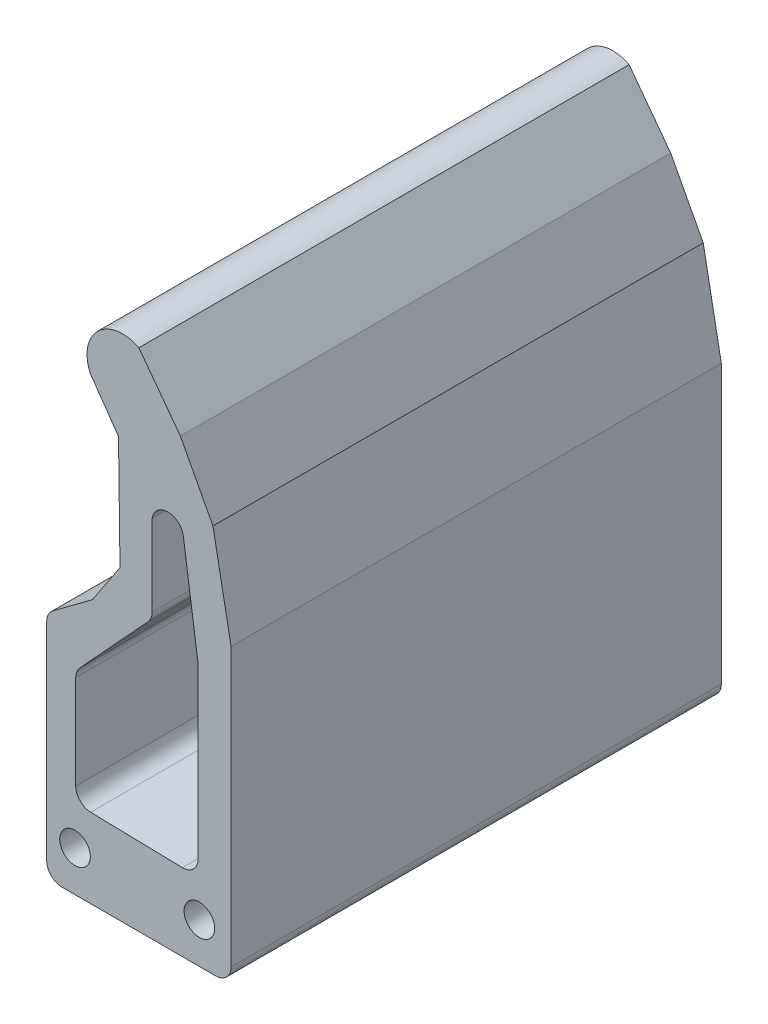
ISO-10303-21;
HEADER;
FILE_DESCRIPTION(('STEP AP214'),'2;1');
FILE_NAME('part.step','',(''),(''),'','','');
FILE_SCHEMA(('AUTOMOTIVE_DESIGN { 1 0 10303 214 1 1 1 1 }'));
ENDSEC;
DATA;
#1=APPLICATION_CONTEXT('core data for automotive mechanical design processes');
#2=APPLICATION_PROTOCOL_DEFINITION('international standard','automotive_design',2000,#1);
#3=PRODUCT_CONTEXT('',#1,'mechanical');
#4=PRODUCT('Part','Part','',(#3));
#5=PRODUCT_RELATED_PRODUCT_CATEGORY('part','',(#4));
#6=PRODUCT_DEFINITION_FORMATION('','',#4);
#7=PRODUCT_DEFINITION_CONTEXT('part definition',#1,'design');
#8=PRODUCT_DEFINITION('design','',#6,#7);
#9=PRODUCT_DEFINITION_SHAPE('','',#8);
#10=(LENGTH_UNIT() NAMED_UNIT(*) SI_UNIT(.MILLI.,.METRE.));
#11=(NAMED_UNIT(*) PLANE_ANGLE_UNIT() SI_UNIT($,.RADIAN.));
#12=(NAMED_UNIT(*) SI_UNIT($,.STERADIAN.) SOLID_ANGLE_UNIT());
#13=UNCERTAINTY_MEASURE_WITH_UNIT(LENGTH_MEASURE(1.E-05),#10,'distance_accuracy_value','');
#14=(GEOMETRIC_REPRESENTATION_CONTEXT(3) GLOBAL_UNCERTAINTY_ASSIGNED_CONTEXT((#13)) GLOBAL_UNIT_ASSIGNED_CONTEXT((#10,
#11,#12)) REPRESENTATION_CONTEXT('',''));
#15=CARTESIAN_POINT('',(0.,0.,0.));
#16=DIRECTION('',(0.,0.,1.));
#17=DIRECTION('',(1.,0.,0.));
#18=AXIS2_PLACEMENT_3D('',#15,#16,#17);
#19=CARTESIAN_POINT('',(-309.924389929028,378.849501293892,72.));
#20=DIRECTION('',(0.,0.,-1.));
#21=DIRECTION('',(-1.,0.,0.));
#22=AXIS2_PLACEMENT_3D('',#19,#20,#21);
#23=PLANE('',#22);
#24=CARTESIAN_POINT('',(-313.031111026464,350.560286037333,72.));
#25=DIRECTION('',(0.,0.,1.));
#26=DIRECTION('',(1.,0.,0.));
#27=AXIS2_PLACEMENT_3D('',#24,#25,#26);
#28=CIRCLE('',#27,0.999999999999998);
#29=CARTESIAN_POINT('',(-312.031111026464,350.560286037333,72.));
#30=VERTEX_POINT('',#29);
#31=EDGE_CURVE('E776',#30,#30,#28,.T.);
#32=ORIENTED_EDGE('',*,*,#31,.F.);
#33=EDGE_LOOP('',(#32));
#34=FACE_BOUND('',#33,.T.);
#35=CARTESIAN_POINT('',(-304.914519909812,350.560286037333,72.));
#36=DIRECTION('',(0.,0.,1.));
#37=DIRECTION('',(1.,0.,0.));
#38=AXIS2_PLACEMENT_3D('',#35,#36,#37);
#39=CIRCLE('',#38,0.999999999999998);
#40=CARTESIAN_POINT('',(-303.914519909812,350.560286037333,72.));
#41=VERTEX_POINT('',#40);
#42=EDGE_CURVE('E485',#41,#41,#39,.T.);
#43=ORIENTED_EDGE('',*,*,#42,.F.);
#44=EDGE_LOOP('',(#43));
#45=FACE_BOUND('',#44,.T.);
#46=DIRECTION('',(0.,-1.,0.));
#47=VECTOR('',#46,1.);
#48=CARTESIAN_POINT('',(-314.881683349609,362.936676025391,72.));
#49=LINE('',#48,#47);
#50=CARTESIAN_POINT('',(-314.881683349609,362.434701670394,72.));
#51=VERTEX_POINT('',#50);
#52=CARTESIAN_POINT('',(-314.881683349609,348.91843813295,72.));
#53=VERTEX_POINT('',#52);
#54=EDGE_CURVE('E296',#51,#53,#49,.T.);
#55=ORIENTED_EDGE('',*,*,#54,.T.);
#56=CARTESIAN_POINT('',(-313.881683349609,348.91843813295,72.));
#57=DIRECTION('',(0.,0.,-1.));
#58=DIRECTION('',(-1.,0.,0.));
#59=AXIS2_PLACEMENT_3D('',#56,#57,#58);
#60=CIRCLE('',#59,1.);
#61=CARTESIAN_POINT('',(-313.881683349609,347.91843813295,72.));
#62=VERTEX_POINT('',#61);
#63=EDGE_CURVE('E418',#53,#62,#60,.F.);
#64=ORIENTED_EDGE('',*,*,#63,.T.);
#65=DIRECTION('',(1.,0.,0.));
#66=VECTOR('',#65,1.);
#67=CARTESIAN_POINT('',(-314.881683349609,347.91843813295,72.));
#68=LINE('',#67,#66);
#69=CARTESIAN_POINT('',(-303.847373472753,347.91843813295,72.));
#70=VERTEX_POINT('',#69);
#71=EDGE_CURVE('E300',#62,#70,#68,.T.);
#72=ORIENTED_EDGE('',*,*,#71,.T.);
#73=CARTESIAN_POINT('',(-303.847373472753,348.91843813295,72.));
#74=DIRECTION('',(0.,0.,-1.));
#75=DIRECTION('',(-1.,0.,0.));
#76=AXIS2_PLACEMENT_3D('',#73,#74,#75);
#77=CIRCLE('',#76,1.);
#78=CARTESIAN_POINT('',(-302.847373472753,348.918438132951,72.));
#79=VERTEX_POINT('',#78);
#80=EDGE_CURVE('E415',#70,#79,#77,.F.);
#81=ORIENTED_EDGE('',*,*,#80,.T.);
#82=DIRECTION('',(0.,1.,0.));
#83=VECTOR('',#82,1.);
#84=CARTESIAN_POINT('',(-302.847373472753,347.91843813295,72.));
#85=LINE('',#84,#83);
#86=CARTESIAN_POINT('',(-302.847373472753,367.045563249939,72.));
#87=VERTEX_POINT('',#86);
#88=EDGE_CURVE('E304',#79,#87,#85,.T.);
#89=ORIENTED_EDGE('',*,*,#88,.T.);
#90=DIRECTION('',(-0.186540617008645,0.982447249579352,0.));
#91=VECTOR('',#90,1.);
#92=CARTESIAN_POINT('',(-302.847373472753,367.045563249939,72.));
#93=LINE('',#92,#91);
#94=CARTESIAN_POINT('',(-304.02806020837,373.263846724187,72.));
#95=VERTEX_POINT('',#94);
#96=EDGE_CURVE('E307',#87,#95,#93,.T.);
#97=ORIENTED_EDGE('',*,*,#96,.T.);
#98=DIRECTION('',(-0.467887720418968,0.883787916347096,0.));
#99=VECTOR('',#98,1.);
#100=CARTESIAN_POINT('',(-304.02806020837,373.263846724187,72.));
#101=LINE('',#100,#99);
#102=CARTESIAN_POINT('',(-306.153296332479,377.278181625284,72.));
#103=VERTEX_POINT('',#102);
#104=EDGE_CURVE('E310',#95,#103,#101,.T.);
#105=ORIENTED_EDGE('',*,*,#104,.T.);
#106=DIRECTION('',(-0.597471837141253,0.801889895074789,0.));
#107=VECTOR('',#106,1.);
#108=CARTESIAN_POINT('',(-306.153296332479,377.278181625284,72.));
#109=LINE('',#108,#107);
#110=CARTESIAN_POINT('',(-308.864528411181,380.917030307284,72.));
#111=VERTEX_POINT('',#110);
#112=EDGE_CURVE('E313',#103,#111,#109,.T.);
#113=ORIENTED_EDGE('',*,*,#112,.T.);
#114=CARTESIAN_POINT('',(-309.924389929028,378.849501293892,72.));
#115=DIRECTION('',(0.,0.,1.));
#116=DIRECTION('',(-1.,0.,0.));
#117=AXIS2_PLACEMENT_3D('',#114,#115,#116);
#118=CIRCLE('',#117,2.32335590433929);
#119=CARTESIAN_POINT('',(-312.030492527549,377.868524993092,72.));
#120=VERTEX_POINT('',#119);
#121=EDGE_CURVE('E278',#111,#120,#118,.T.);
#122=ORIENTED_EDGE('',*,*,#121,.T.);
#123=DIRECTION('',(0.57346234436332,-0.819231920519046,0.));
#124=VECTOR('',#123,1.);
#125=CARTESIAN_POINT('',(-312.030492527549,377.868524993092,72.));
#126=LINE('',#125,#124);
#127=CARTESIAN_POINT('',(-310.193868716589,375.244776691722,72.));
#128=VERTEX_POINT('',#127);
#129=EDGE_CURVE('E282',#120,#128,#126,.T.);
#130=ORIENTED_EDGE('',*,*,#129,.T.);
#131=DIRECTION('',(0.0132778277471396,-0.999911845759574,0.));
#132=VECTOR('',#131,1.);
#133=CARTESIAN_POINT('',(-310.193868716589,375.244776691722,72.));
#134=LINE('',#133,#132);
#135=CARTESIAN_POINT('',(-310.096008300781,367.875213623047,72.));
#136=VERTEX_POINT('',#135);
#137=EDGE_CURVE('E286',#128,#136,#134,.T.);
#138=ORIENTED_EDGE('',*,*,#137,.T.);
#139=DIRECTION('',(-0.551967778134634,-0.833865439924881,0.));
#140=VECTOR('',#139,1.);
#141=CARTESIAN_POINT('',(-310.096008300781,367.875213623047,72.));
#142=LINE('',#141,#140);
#143=CARTESIAN_POINT('',(-311.889068603516,365.166412353516,72.));
#144=VERTEX_POINT('',#143);
#145=EDGE_CURVE('E289',#136,#144,#142,.T.);
#146=ORIENTED_EDGE('',*,*,#145,.T.);
#147=DIRECTION('',(-0.801889895074793,-0.597471837141247,0.));
#148=VECTOR('',#147,1.);
#149=CARTESIAN_POINT('',(-311.889068603516,365.166412353516,72.));
#150=LINE('',#149,#148);
#151=CARTESIAN_POINT('',(-314.479155186751,363.236591565468,72.));
#152=VERTEX_POINT('',#151);
#153=EDGE_CURVE('E292',#144,#152,#150,.T.);
#154=ORIENTED_EDGE('',*,*,#153,.T.);
#155=CARTESIAN_POINT('',(-313.881683349609,362.434701670394,72.));
#156=DIRECTION('',(0.,0.,-1.));
#157=DIRECTION('',(-1.,0.,0.));
#158=AXIS2_PLACEMENT_3D('',#155,#156,#157);
#159=CIRCLE('',#158,1.);
#160=EDGE_CURVE('E412',#152,#51,#159,.F.);
#161=ORIENTED_EDGE('',*,*,#160,.T.);
#162=EDGE_LOOP('',(#55,#64,#72,#81,#89,#97,#105,#113,#122,#130,#138,#146,#154,#161));
#163=FACE_BOUND('',#162,.T.);
#164=DIRECTION('',(-0.677265288833009,-0.735738899706914,0.));
#165=VECTOR('',#164,1.);
#166=CARTESIAN_POINT('',(-312.988408733801,360.598376943002,72.));
#167=LINE('',#166,#165);
#168=CARTESIAN_POINT('',(-308.25886216006,365.736262273391,72.));
#169=VERTEX_POINT('',#168);
#170=CARTESIAN_POINT('',(-312.724147633508,360.885453771492,72.));
#171=VERTEX_POINT('',#170);
#172=EDGE_CURVE('E273',#169,#171,#167,.T.);
#173=ORIENTED_EDGE('',*,*,#172,.F.);
#174=CARTESIAN_POINT('',(-308.994601059767,366.413527562224,72.));
#175=DIRECTION('',(0.,0.,-1.));
#176=DIRECTION('',(-1.,0.,0.));
#177=AXIS2_PLACEMENT_3D('',#174,#175,#176);
#178=CIRCLE('',#177,1.);
#179=CARTESIAN_POINT('',(-307.994601059767,366.413527562224,72.));
#180=VERTEX_POINT('',#179);
#181=EDGE_CURVE('E409',#169,#180,#178,.F.);
#182=ORIENTED_EDGE('',*,*,#181,.T.);
#183=DIRECTION('',(0.,-1.,0.));
#184=VECTOR('',#183,1.);
#185=CARTESIAN_POINT('',(-307.994601059767,366.023339101882,72.));
#186=LINE('',#185,#184);
#187=CARTESIAN_POINT('',(-307.994601059767,371.702683918454,72.));
#188=VERTEX_POINT('',#187);
#189=EDGE_CURVE('E239',#188,#180,#186,.T.);
#190=ORIENTED_EDGE('',*,*,#189,.F.);
#191=CARTESIAN_POINT('',(-306.975817077351,371.555647556688,72.));
#192=DIRECTION('',(0.,0.,1.));
#193=DIRECTION('',(-1.,0.,0.));
#194=AXIS2_PLACEMENT_3D('',#191,#192,#193);
#195=CIRCLE('',#194,1.02933983431598);
#196=CARTESIAN_POINT('',(-305.952850341797,371.670013427734,72.));
#197=VERTEX_POINT('',#196);
#198=EDGE_CURVE('E235',#197,#188,#195,.T.);
#199=ORIENTED_EDGE('',*,*,#198,.F.);
#200=DIRECTION('',(-0.141420088017463,0.989949674834601,0.));
#201=VECTOR('',#200,1.);
#202=CARTESIAN_POINT('',(-305.,365.,72.));
#203=LINE('',#202,#201);
#204=CARTESIAN_POINT('',(-305.,365.,72.));
#205=VERTEX_POINT('',#204);
#206=EDGE_CURVE('E219',#205,#197,#203,.T.);
#207=ORIENTED_EDGE('',*,*,#206,.F.);
#208=DIRECTION('',(0.,1.,0.));
#209=VECTOR('',#208,1.);
#210=CARTESIAN_POINT('',(-305.,352.927314192685,72.));
#211=LINE('',#210,#209);
#212=CARTESIAN_POINT('',(-305.,353.950441861552,72.));
#213=VERTEX_POINT('',#212);
#214=EDGE_CURVE('E208',#213,#205,#211,.T.);
#215=ORIENTED_EDGE('',*,*,#214,.F.);
#216=CARTESIAN_POINT('',(-306.,353.950441861552,72.));
#217=DIRECTION('',(0.,0.,-1.));
#218=DIRECTION('',(-1.,0.,0.));
#219=AXIS2_PLACEMENT_3D('',#216,#217,#218);
#220=CIRCLE('',#219,1.);
#221=CARTESIAN_POINT('',(-306.022860294224,352.950703192225,72.));
#222=VERTEX_POINT('',#221);
#223=EDGE_CURVE('E457',#213,#222,#220,.T.);
#224=ORIENTED_EDGE('',*,*,#223,.T.);
#225=DIRECTION('',(0.999738669327124,-0.0228602942245161,0.));
#226=VECTOR('',#225,1.);
#227=CARTESIAN_POINT('',(-312.988408733801,353.109979302722,72.));
#228=LINE('',#227,#226);
#229=CARTESIAN_POINT('',(-312.011269028026,353.087635762497,72.));
#230=VERTEX_POINT('',#229);
#231=EDGE_CURVE('E220',#230,#222,#228,.T.);
#232=ORIENTED_EDGE('',*,*,#231,.F.);
#233=CARTESIAN_POINT('',(-311.988408733801,354.087374431824,72.));
#234=DIRECTION('',(0.,0.,-1.));
#235=DIRECTION('',(-1.,0.,0.));
#236=AXIS2_PLACEMENT_3D('',#233,#234,#235);
#237=CIRCLE('',#236,1.);
#238=CARTESIAN_POINT('',(-312.988408733801,354.087374431824,72.));
#239=VERTEX_POINT('',#238);
#240=EDGE_CURVE('E55',#230,#239,#237,.T.);
#241=ORIENTED_EDGE('',*,*,#240,.T.);
#242=DIRECTION('',(0.,-1.,0.));
#243=VECTOR('',#242,1.);
#244=CARTESIAN_POINT('',(-312.988408733801,360.598376943002,72.));
#245=LINE('',#244,#243);
#246=CARTESIAN_POINT('',(-312.988408733801,360.208188482659,72.));
#247=VERTEX_POINT('',#246);
#248=EDGE_CURVE('E476',#247,#239,#245,.T.);
#249=ORIENTED_EDGE('',*,*,#248,.F.);
#250=CARTESIAN_POINT('',(-311.988408733801,360.208188482659,72.));
#251=DIRECTION('',(0.,0.,-1.));
#252=DIRECTION('',(-1.,0.,0.));
#253=AXIS2_PLACEMENT_3D('',#250,#251,#252);
#254=CIRCLE('',#253,1.);
#255=EDGE_CURVE('E11',#247,#171,#254,.T.);
#256=ORIENTED_EDGE('',*,*,#255,.T.);
#257=EDGE_LOOP('',(#173,#182,#190,#199,#207,#215,#224,#232,#241,#249,#256));
#258=FACE_BOUND('',#257,.T.);
#259=ADVANCED_FACE('F39',(#34,#45,#163,#258),#23,.F.);
#260=CARTESIAN_POINT('',(-309.924389929028,378.849501293892,40.));
#261=DIRECTION('',(0.,0.,-1.));
#262=DIRECTION('',(-1.,0.,0.));
#263=AXIS2_PLACEMENT_3D('',#260,#261,#262);
#264=PLANE('',#263);
#265=CARTESIAN_POINT('',(-313.031111026464,350.560286037333,40.));
#266=DIRECTION('',(0.,0.,1.));
#267=DIRECTION('',(1.,0.,0.));
#268=AXIS2_PLACEMENT_3D('',#265,#266,#267);
#269=CIRCLE('',#268,0.999999999999998);
#270=CARTESIAN_POINT('',(-312.031111026464,350.560286037333,40.));
#271=VERTEX_POINT('',#270);
#272=EDGE_CURVE('E252',#271,#271,#269,.T.);
#273=ORIENTED_EDGE('',*,*,#272,.T.);
#274=EDGE_LOOP('',(#273));
#275=FACE_BOUND('',#274,.T.);
#276=CARTESIAN_POINT('',(-304.914519909812,350.560286037333,40.));
#277=DIRECTION('',(0.,0.,1.));
#278=DIRECTION('',(1.,0.,0.));
#279=AXIS2_PLACEMENT_3D('',#276,#277,#278);
#280=CIRCLE('',#279,0.999999999999998);
#281=CARTESIAN_POINT('',(-303.914519909812,350.560286037333,40.));
#282=VERTEX_POINT('',#281);
#283=EDGE_CURVE('E778',#282,#282,#280,.T.);
#284=ORIENTED_EDGE('',*,*,#283,.T.);
#285=EDGE_LOOP('',(#284));
#286=FACE_BOUND('',#285,.T.);
#287=DIRECTION('',(1.,0.,0.));
#288=VECTOR('',#287,1.);
#289=CARTESIAN_POINT('',(-314.881683349609,347.91843813295,40.));
#290=LINE('',#289,#288);
#291=CARTESIAN_POINT('',(-313.881683349609,347.91843813295,40.));
#292=VERTEX_POINT('',#291);
#293=CARTESIAN_POINT('',(-303.847373472753,347.91843813295,40.));
#294=VERTEX_POINT('',#293);
#295=EDGE_CURVE('E337',#292,#294,#290,.T.);
#296=ORIENTED_EDGE('',*,*,#295,.F.);
#297=CARTESIAN_POINT('',(-313.881683349609,348.91843813295,40.));
#298=DIRECTION('',(0.,0.,-1.));
#299=DIRECTION('',(-1.,0.,0.));
#300=AXIS2_PLACEMENT_3D('',#297,#298,#299);
#301=CIRCLE('',#300,1.);
#302=CARTESIAN_POINT('',(-314.881683349609,348.91843813295,40.));
#303=VERTEX_POINT('',#302);
#304=EDGE_CURVE('E399',#292,#303,#301,.T.);
#305=ORIENTED_EDGE('',*,*,#304,.T.);
#306=DIRECTION('',(0.,-1.,0.));
#307=VECTOR('',#306,1.);
#308=CARTESIAN_POINT('',(-314.881683349609,362.936676025391,40.));
#309=LINE('',#308,#307);
#310=CARTESIAN_POINT('',(-314.881683349609,362.434701670394,40.));
#311=VERTEX_POINT('',#310);
#312=EDGE_CURVE('E333',#311,#303,#309,.T.);
#313=ORIENTED_EDGE('',*,*,#312,.F.);
#314=CARTESIAN_POINT('',(-313.881683349609,362.434701670394,40.));
#315=DIRECTION('',(0.,0.,-1.));
#316=DIRECTION('',(-1.,0.,0.));
#317=AXIS2_PLACEMENT_3D('',#314,#315,#316);
#318=CIRCLE('',#317,1.);
#319=CARTESIAN_POINT('',(-314.479155186751,363.236591565468,40.));
#320=VERTEX_POINT('',#319);
#321=EDGE_CURVE('E393',#311,#320,#318,.T.);
#322=ORIENTED_EDGE('',*,*,#321,.T.);
#323=DIRECTION('',(-0.801889895074793,-0.597471837141247,0.));
#324=VECTOR('',#323,1.);
#325=CARTESIAN_POINT('',(-311.889068603516,365.166412353516,40.));
#326=LINE('',#325,#324);
#327=CARTESIAN_POINT('',(-311.889068603516,365.166412353516,40.));
#328=VERTEX_POINT('',#327);
#329=EDGE_CURVE('E329',#328,#320,#326,.T.);
#330=ORIENTED_EDGE('',*,*,#329,.F.);
#331=DIRECTION('',(-0.551967778134634,-0.833865439924881,0.));
#332=VECTOR('',#331,1.);
#333=CARTESIAN_POINT('',(-310.096008300781,367.875213623047,40.));
#334=LINE('',#333,#332);
#335=CARTESIAN_POINT('',(-310.096008300781,367.875213623047,40.));
#336=VERTEX_POINT('',#335);
#337=EDGE_CURVE('E326',#336,#328,#334,.T.);
#338=ORIENTED_EDGE('',*,*,#337,.F.);
#339=DIRECTION('',(0.0132778277471396,-0.999911845759574,0.));
#340=VECTOR('',#339,1.);
#341=CARTESIAN_POINT('',(-310.193868716589,375.244776691722,40.));
#342=LINE('',#341,#340);
#343=CARTESIAN_POINT('',(-310.193868716589,375.244776691722,40.));
#344=VERTEX_POINT('',#343);
#345=EDGE_CURVE('E323',#344,#336,#342,.T.);
#346=ORIENTED_EDGE('',*,*,#345,.F.);
#347=DIRECTION('',(0.57346234436332,-0.819231920519046,0.));
#348=VECTOR('',#347,1.);
#349=CARTESIAN_POINT('',(-312.030492527549,377.868524993092,40.));
#350=LINE('',#349,#348);
#351=CARTESIAN_POINT('',(-312.030492527549,377.868524993092,40.));
#352=VERTEX_POINT('',#351);
#353=EDGE_CURVE('E320',#352,#344,#350,.T.);
#354=ORIENTED_EDGE('',*,*,#353,.F.);
#355=CARTESIAN_POINT('',(-309.924389929028,378.849501293892,40.));
#356=DIRECTION('',(0.,0.,1.));
#357=DIRECTION('',(-1.,0.,0.));
#358=AXIS2_PLACEMENT_3D('',#355,#356,#357);
#359=CIRCLE('',#358,2.32335590433929);
#360=CARTESIAN_POINT('',(-308.864528411181,380.917030307284,40.));
#361=VERTEX_POINT('',#360);
#362=EDGE_CURVE('E228',#361,#352,#359,.T.);
#363=ORIENTED_EDGE('',*,*,#362,.F.);
#364=DIRECTION('',(-0.597471837141253,0.801889895074789,0.));
#365=VECTOR('',#364,1.);
#366=CARTESIAN_POINT('',(-306.153296332479,377.278181625284,40.));
#367=LINE('',#366,#365);
#368=CARTESIAN_POINT('',(-306.153296332479,377.278181625284,40.));
#369=VERTEX_POINT('',#368);
#370=EDGE_CURVE('E283',#369,#361,#367,.T.);
#371=ORIENTED_EDGE('',*,*,#370,.F.);
#372=DIRECTION('',(-0.467887720418968,0.883787916347096,0.));
#373=VECTOR('',#372,1.);
#374=CARTESIAN_POINT('',(-304.02806020837,373.263846724187,40.));
#375=LINE('',#374,#373);
#376=CARTESIAN_POINT('',(-304.02806020837,373.263846724187,40.));
#377=VERTEX_POINT('',#376);
#378=EDGE_CURVE('E347',#377,#369,#375,.T.);
#379=ORIENTED_EDGE('',*,*,#378,.F.);
#380=DIRECTION('',(-0.186540617008645,0.982447249579352,0.));
#381=VECTOR('',#380,1.);
#382=CARTESIAN_POINT('',(-302.847373472753,367.045563249939,40.));
#383=LINE('',#382,#381);
#384=CARTESIAN_POINT('',(-302.847373472753,367.045563249939,40.));
#385=VERTEX_POINT('',#384);
#386=EDGE_CURVE('E344',#385,#377,#383,.T.);
#387=ORIENTED_EDGE('',*,*,#386,.F.);
#388=DIRECTION('',(0.,1.,0.));
#389=VECTOR('',#388,1.);
#390=CARTESIAN_POINT('',(-302.847373472753,347.91843813295,40.));
#391=LINE('',#390,#389);
#392=CARTESIAN_POINT('',(-302.847373472753,348.918438132951,40.));
#393=VERTEX_POINT('',#392);
#394=EDGE_CURVE('E341',#393,#385,#391,.T.);
#395=ORIENTED_EDGE('',*,*,#394,.F.);
#396=CARTESIAN_POINT('',(-303.847373472753,348.91843813295,40.));
#397=DIRECTION('',(0.,0.,-1.));
#398=DIRECTION('',(-1.,0.,0.));
#399=AXIS2_PLACEMENT_3D('',#396,#397,#398);
#400=CIRCLE('',#399,1.);
#401=EDGE_CURVE('E396',#393,#294,#400,.T.);
#402=ORIENTED_EDGE('',*,*,#401,.T.);
#403=EDGE_LOOP('',(#296,#305,#313,#322,#330,#338,#346,#354,#363,#371,#379,#387,#395,#402));
#404=FACE_BOUND('',#403,.T.);
#405=DIRECTION('',(0.,-1.,0.));
#406=VECTOR('',#405,1.);
#407=CARTESIAN_POINT('',(-307.994601059767,366.023339101882,40.));
#408=LINE('',#407,#406);
#409=CARTESIAN_POINT('',(-307.994601059767,371.702683918454,40.));
#410=VERTEX_POINT('',#409);
#411=CARTESIAN_POINT('',(-307.994601059767,366.413527562224,40.));
#412=VERTEX_POINT('',#411);
#413=EDGE_CURVE('E269',#410,#412,#408,.T.);
#414=ORIENTED_EDGE('',*,*,#413,.T.);
#415=CARTESIAN_POINT('',(-308.994601059767,366.413527562224,40.));
#416=DIRECTION('',(0.,0.,-1.));
#417=DIRECTION('',(-1.,0.,0.));
#418=AXIS2_PLACEMENT_3D('',#415,#416,#417);
#419=CIRCLE('',#418,1.);
#420=CARTESIAN_POINT('',(-308.25886216006,365.736262273391,40.));
#421=VERTEX_POINT('',#420);
#422=EDGE_CURVE('E390',#412,#421,#419,.T.);
#423=ORIENTED_EDGE('',*,*,#422,.T.);
#424=DIRECTION('',(-0.677265288833009,-0.735738899706914,0.));
#425=VECTOR('',#424,1.);
#426=CARTESIAN_POINT('',(-312.988408733801,360.598376943002,40.));
#427=LINE('',#426,#425);
#428=CARTESIAN_POINT('',(-312.724147633508,360.885453771492,40.));
#429=VERTEX_POINT('',#428);
#430=EDGE_CURVE('E247',#421,#429,#427,.T.);
#431=ORIENTED_EDGE('',*,*,#430,.T.);
#432=CARTESIAN_POINT('',(-311.988408733801,360.208188482659,40.));
#433=DIRECTION('',(0.,0.,-1.));
#434=DIRECTION('',(-1.,0.,0.));
#435=AXIS2_PLACEMENT_3D('',#432,#433,#434);
#436=CIRCLE('',#435,1.);
#437=CARTESIAN_POINT('',(-312.988408733801,360.208188482659,40.));
#438=VERTEX_POINT('',#437);
#439=EDGE_CURVE('E48',#429,#438,#436,.F.);
#440=ORIENTED_EDGE('',*,*,#439,.T.);
#441=DIRECTION('',(0.,-1.,0.));
#442=VECTOR('',#441,1.);
#443=CARTESIAN_POINT('',(-312.988408733801,360.598376943002,40.));
#444=LINE('',#443,#442);
#445=CARTESIAN_POINT('',(-312.988408733801,354.087374431824,40.));
#446=VERTEX_POINT('',#445);
#447=EDGE_CURVE('E251',#438,#446,#444,.T.);
#448=ORIENTED_EDGE('',*,*,#447,.T.);
#449=CARTESIAN_POINT('',(-311.988408733801,354.087374431824,40.));
#450=DIRECTION('',(0.,0.,-1.));
#451=DIRECTION('',(-1.,0.,0.));
#452=AXIS2_PLACEMENT_3D('',#449,#450,#451);
#453=CIRCLE('',#452,1.);
#454=CARTESIAN_POINT('',(-312.011269028026,353.087635762497,40.));
#455=VERTEX_POINT('',#454);
#456=EDGE_CURVE('E460',#446,#455,#453,.F.);
#457=ORIENTED_EDGE('',*,*,#456,.T.);
#458=DIRECTION('',(0.999738669327124,-0.0228602942245161,0.));
#459=VECTOR('',#458,1.);
#460=CARTESIAN_POINT('',(-312.988408733801,353.109979302722,40.));
#461=LINE('',#460,#459);
#462=CARTESIAN_POINT('',(-306.022860294224,352.950703192225,40.));
#463=VERTEX_POINT('',#462);
#464=EDGE_CURVE('E256',#455,#463,#461,.T.);
#465=ORIENTED_EDGE('',*,*,#464,.T.);
#466=CARTESIAN_POINT('',(-306.,353.950441861552,40.));
#467=DIRECTION('',(0.,0.,-1.));
#468=DIRECTION('',(-1.,0.,0.));
#469=AXIS2_PLACEMENT_3D('',#466,#467,#468);
#470=CIRCLE('',#469,1.);
#471=CARTESIAN_POINT('',(-305.,353.950441861552,40.));
#472=VERTEX_POINT('',#471);
#473=EDGE_CURVE('E454',#463,#472,#470,.F.);
#474=ORIENTED_EDGE('',*,*,#473,.T.);
#475=DIRECTION('',(0.,1.,0.));
#476=VECTOR('',#475,1.);
#477=CARTESIAN_POINT('',(-305.,352.927314192685,40.));
#478=LINE('',#477,#476);
#479=CARTESIAN_POINT('',(-305.,365.,40.));
#480=VERTEX_POINT('',#479);
#481=EDGE_CURVE('E260',#472,#480,#478,.T.);
#482=ORIENTED_EDGE('',*,*,#481,.T.);
#483=DIRECTION('',(-0.141420088017463,0.989949674834601,0.));
#484=VECTOR('',#483,1.);
#485=CARTESIAN_POINT('',(-305.,365.,40.));
#486=LINE('',#485,#484);
#487=CARTESIAN_POINT('',(-305.952850341797,371.670013427734,40.));
#488=VERTEX_POINT('',#487);
#489=EDGE_CURVE('E226',#480,#488,#486,.T.);
#490=ORIENTED_EDGE('',*,*,#489,.T.);
#491=CARTESIAN_POINT('',(-306.975817077351,371.555647556688,40.));
#492=DIRECTION('',(0.,0.,1.));
#493=DIRECTION('',(-1.,0.,0.));
#494=AXIS2_PLACEMENT_3D('',#491,#492,#493);
#495=CIRCLE('',#494,1.02933983431598);
#496=EDGE_CURVE('E265',#488,#410,#495,.T.);
#497=ORIENTED_EDGE('',*,*,#496,.T.);
#498=EDGE_LOOP('',(#414,#423,#431,#440,#448,#457,#465,#474,#482,#490,#497));
#499=FACE_BOUND('',#498,.T.);
#500=ADVANCED_FACE('F466',(#275,#286,#404,#499),#264,.T.);
#501=CARTESIAN_POINT('',(-309.924389929028,378.849501293892,72.));
#502=DIRECTION('',(0.,0.,-1.));
#503=DIRECTION('',(-1.,0.,0.));
#504=AXIS2_PLACEMENT_3D('',#501,#502,#503);
#505=CYLINDRICAL_SURFACE('',#504,2.32335590433929);
#506=ORIENTED_EDGE('',*,*,#362,.T.);
#507=DIRECTION('',(0.,0.,-1.));
#508=VECTOR('',#507,1.);
#509=CARTESIAN_POINT('',(-312.030492527549,377.868524993092,72.));
#510=LINE('',#509,#508);
#511=EDGE_CURVE('E379',#120,#352,#510,.T.);
#512=ORIENTED_EDGE('',*,*,#511,.F.);
#513=ORIENTED_EDGE('',*,*,#121,.F.);
#514=DIRECTION('',(0.,0.,-1.));
#515=VECTOR('',#514,1.);
#516=CARTESIAN_POINT('',(-308.864528411181,380.917030307284,72.));
#517=LINE('',#516,#515);
#518=EDGE_CURVE('E316',#111,#361,#517,.T.);
#519=ORIENTED_EDGE('',*,*,#518,.T.);
#520=EDGE_LOOP('',(#506,#512,#513,#519));
#521=FACE_BOUND('',#520,.T.);
#522=ADVANCED_FACE('F516',(#521),#505,.T.);
#523=CARTESIAN_POINT('',(-312.030492527549,377.868524993092,72.));
#524=DIRECTION('',(0.819231920519046,0.57346234436332,0.));
#525=DIRECTION('',(-0.57346234436332,0.819231920519046,0.));
#526=AXIS2_PLACEMENT_3D('',#523,#524,#525);
#527=PLANE('',#526);
#528=ORIENTED_EDGE('',*,*,#353,.T.);
#529=DIRECTION('',(0.,0.,-1.));
#530=VECTOR('',#529,1.);
#531=CARTESIAN_POINT('',(-310.193868716589,375.244776691722,72.));
#532=LINE('',#531,#530);
#533=EDGE_CURVE('E375',#128,#344,#532,.T.);
#534=ORIENTED_EDGE('',*,*,#533,.F.);
#535=ORIENTED_EDGE('',*,*,#129,.F.);
#536=ORIENTED_EDGE('',*,*,#511,.T.);
#537=EDGE_LOOP('',(#528,#534,#535,#536));
#538=FACE_BOUND('',#537,.T.);
#539=ADVANCED_FACE('F559',(#538),#527,.F.);
#540=CARTESIAN_POINT('',(-310.193868716589,375.244776691722,72.));
#541=DIRECTION('',(0.999911845759573,0.0132778277471396,0.));
#542=DIRECTION('',(-0.0132778277471396,0.999911845759574,0.));
#543=AXIS2_PLACEMENT_3D('',#540,#541,#542);
#544=PLANE('',#543);
#545=ORIENTED_EDGE('',*,*,#345,.T.);
#546=DIRECTION('',(0.,0.,-1.));
#547=VECTOR('',#546,1.);
#548=CARTESIAN_POINT('',(-310.096008300781,367.875213623047,72.));
#549=LINE('',#548,#547);
#550=EDGE_CURVE('E371',#136,#336,#549,.T.);
#551=ORIENTED_EDGE('',*,*,#550,.F.);
#552=ORIENTED_EDGE('',*,*,#137,.F.);
#553=ORIENTED_EDGE('',*,*,#533,.T.);
#554=EDGE_LOOP('',(#545,#551,#552,#553));
#555=FACE_BOUND('',#554,.T.);
#556=ADVANCED_FACE('F555',(#555),#544,.F.);
#557=CARTESIAN_POINT('',(-310.096008300781,367.875213623047,72.));
#558=DIRECTION('',(0.833865439924881,-0.551967778134634,0.));
#559=DIRECTION('',(0.551967778134634,0.833865439924881,0.));
#560=AXIS2_PLACEMENT_3D('',#557,#558,#559);
#561=PLANE('',#560);
#562=ORIENTED_EDGE('',*,*,#337,.T.);
#563=DIRECTION('',(0.,0.,-1.));
#564=VECTOR('',#563,1.);
#565=CARTESIAN_POINT('',(-311.889068603516,365.166412353516,72.));
#566=LINE('',#565,#564);
#567=EDGE_CURVE('E367',#144,#328,#566,.T.);
#568=ORIENTED_EDGE('',*,*,#567,.F.);
#569=ORIENTED_EDGE('',*,*,#145,.F.);
#570=ORIENTED_EDGE('',*,*,#550,.T.);
#571=EDGE_LOOP('',(#562,#568,#569,#570));
#572=FACE_BOUND('',#571,.T.);
#573=ADVANCED_FACE('F551',(#572),#561,.F.);
#574=CARTESIAN_POINT('',(-311.889068603516,365.166412353516,72.));
#575=DIRECTION('',(0.597471837141247,-0.801889895074793,0.));
#576=DIRECTION('',(0.801889895074793,0.597471837141247,0.));
#577=AXIS2_PLACEMENT_3D('',#574,#575,#576);
#578=PLANE('',#577);
#579=ORIENTED_EDGE('',*,*,#329,.T.);
#580=DIRECTION('',(0.,0.,-1.));
#581=VECTOR('',#580,1.);
#582=CARTESIAN_POINT('',(-314.479155186751,363.236591565468,72.));
#583=LINE('',#582,#581);
#584=EDGE_CURVE('E440',#320,#152,#583,.F.);
#585=ORIENTED_EDGE('',*,*,#584,.T.);
#586=ORIENTED_EDGE('',*,*,#153,.F.);
#587=ORIENTED_EDGE('',*,*,#567,.T.);
#588=EDGE_LOOP('',(#579,#585,#586,#587));
#589=FACE_BOUND('',#588,.T.);
#590=ADVANCED_FACE('F547',(#589),#578,.F.);
#591=CARTESIAN_POINT('',(-314.881683349609,362.936676025391,72.));
#592=DIRECTION('',(1.,0.,0.));
#593=DIRECTION('',(0.,0.,-1.));
#594=AXIS2_PLACEMENT_3D('',#591,#592,#593);
#595=PLANE('',#594);
#596=ORIENTED_EDGE('',*,*,#312,.T.);
#597=DIRECTION('',(0.,0.,-1.));
#598=VECTOR('',#597,1.);
#599=CARTESIAN_POINT('',(-314.881683349609,348.91843813295,72.));
#600=LINE('',#599,#598);
#601=EDGE_CURVE('E406',#303,#53,#600,.F.);
#602=ORIENTED_EDGE('',*,*,#601,.T.);
#603=ORIENTED_EDGE('',*,*,#54,.F.);
#604=DIRECTION('',(0.,0.,-1.));
#605=VECTOR('',#604,1.);
#606=CARTESIAN_POINT('',(-314.881683349609,362.434701670394,72.));
#607=LINE('',#606,#605);
#608=EDGE_CURVE('E402',#51,#311,#607,.T.);
#609=ORIENTED_EDGE('',*,*,#608,.T.);
#610=EDGE_LOOP('',(#596,#602,#603,#609));
#611=FACE_BOUND('',#610,.T.);
#612=ADVANCED_FACE('F543',(#611),#595,.F.);
#613=CARTESIAN_POINT('',(-314.881683349609,347.91843813295,72.));
#614=DIRECTION('',(0.,1.,0.));
#615=DIRECTION('',(0.,0.,1.));
#616=AXIS2_PLACEMENT_3D('',#613,#614,#615);
#617=PLANE('',#616);
#618=ORIENTED_EDGE('',*,*,#71,.F.);
#619=DIRECTION('',(0.,0.,-1.));
#620=VECTOR('',#619,1.);
#621=CARTESIAN_POINT('',(-313.881683349609,347.91843813295,72.));
#622=LINE('',#621,#620);
#623=EDGE_CURVE('E386',#62,#292,#622,.T.);
#624=ORIENTED_EDGE('',*,*,#623,.T.);
#625=ORIENTED_EDGE('',*,*,#295,.T.);
#626=DIRECTION('',(0.,0.,-1.));
#627=VECTOR('',#626,1.);
#628=CARTESIAN_POINT('',(-303.847373472753,347.91843813295,72.));
#629=LINE('',#628,#627);
#630=EDGE_CURVE('E383',#294,#70,#629,.F.);
#631=ORIENTED_EDGE('',*,*,#630,.T.);
#632=EDGE_LOOP('',(#618,#624,#625,#631));
#633=FACE_BOUND('',#632,.T.);
#634=ADVANCED_FACE('F539',(#633),#617,.F.);
#635=CARTESIAN_POINT('',(-302.847373472753,347.91843813295,72.));
#636=DIRECTION('',(-1.,0.,0.));
#637=DIRECTION('',(0.,-1.,0.));
#638=AXIS2_PLACEMENT_3D('',#635,#636,#637);
#639=PLANE('',#638);
#640=ORIENTED_EDGE('',*,*,#88,.F.);
#641=DIRECTION('',(0.,0.,-1.));
#642=VECTOR('',#641,1.);
#643=CARTESIAN_POINT('',(-302.847373472753,348.918438132951,72.));
#644=LINE('',#643,#642);
#645=EDGE_CURVE('E430',#79,#393,#644,.T.);
#646=ORIENTED_EDGE('',*,*,#645,.T.);
#647=ORIENTED_EDGE('',*,*,#394,.T.);
#648=DIRECTION('',(0.,0.,-1.));
#649=VECTOR('',#648,1.);
#650=CARTESIAN_POINT('',(-302.847373472753,367.045563249939,72.));
#651=LINE('',#650,#649);
#652=EDGE_CURVE('E363',#87,#385,#651,.T.);
#653=ORIENTED_EDGE('',*,*,#652,.F.);
#654=EDGE_LOOP('',(#640,#646,#647,#653));
#655=FACE_BOUND('',#654,.T.);
#656=ADVANCED_FACE('F535',(#655),#639,.F.);
#657=CARTESIAN_POINT('',(-302.847373472753,367.045563249939,72.));
#658=DIRECTION('',(-0.982447249579352,-0.186540617008645,0.));
#659=DIRECTION('',(0.186540617008645,-0.982447249579352,0.));
#660=AXIS2_PLACEMENT_3D('',#657,#658,#659);
#661=PLANE('',#660);
#662=ORIENTED_EDGE('',*,*,#386,.T.);
#663=DIRECTION('',(0.,0.,-1.));
#664=VECTOR('',#663,1.);
#665=CARTESIAN_POINT('',(-304.02806020837,373.263846724187,72.));
#666=LINE('',#665,#664);
#667=EDGE_CURVE('E359',#95,#377,#666,.T.);
#668=ORIENTED_EDGE('',*,*,#667,.F.);
#669=ORIENTED_EDGE('',*,*,#96,.F.);
#670=ORIENTED_EDGE('',*,*,#652,.T.);
#671=EDGE_LOOP('',(#662,#668,#669,#670));
#672=FACE_BOUND('',#671,.T.);
#673=ADVANCED_FACE('F531',(#672),#661,.F.);
#674=CARTESIAN_POINT('',(-304.02806020837,373.263846724187,72.));
#675=DIRECTION('',(-0.883787916347096,-0.467887720418968,0.));
#676=DIRECTION('',(0.467887720418968,-0.883787916347096,0.));
#677=AXIS2_PLACEMENT_3D('',#674,#675,#676);
#678=PLANE('',#677);
#679=ORIENTED_EDGE('',*,*,#378,.T.);
#680=DIRECTION('',(0.,0.,-1.));
#681=VECTOR('',#680,1.);
#682=CARTESIAN_POINT('',(-306.153296332479,377.278181625284,72.));
#683=LINE('',#682,#681);
#684=EDGE_CURVE('E355',#103,#369,#683,.T.);
#685=ORIENTED_EDGE('',*,*,#684,.F.);
#686=ORIENTED_EDGE('',*,*,#104,.F.);
#687=ORIENTED_EDGE('',*,*,#667,.T.);
#688=EDGE_LOOP('',(#679,#685,#686,#687));
#689=FACE_BOUND('',#688,.T.);
#690=ADVANCED_FACE('F527',(#689),#678,.F.);
#691=CARTESIAN_POINT('',(-306.153296332479,377.278181625284,72.));
#692=DIRECTION('',(-0.801889895074789,-0.597471837141253,0.));
#693=DIRECTION('',(0.597471837141253,-0.801889895074789,0.));
#694=AXIS2_PLACEMENT_3D('',#691,#692,#693);
#695=PLANE('',#694);
#696=ORIENTED_EDGE('',*,*,#370,.T.);
#697=ORIENTED_EDGE('',*,*,#518,.F.);
#698=ORIENTED_EDGE('',*,*,#112,.F.);
#699=ORIENTED_EDGE('',*,*,#684,.T.);
#700=EDGE_LOOP('',(#696,#697,#698,#699));
#701=FACE_BOUND('',#700,.T.);
#702=ADVANCED_FACE('F524',(#701),#695,.F.);
#703=CARTESIAN_POINT('',(-312.988408733801,360.598376943002,72.));
#704=DIRECTION('',(0.735738899706914,-0.677265288833009,0.));
#705=DIRECTION('',(0.677265288833009,0.735738899706914,0.));
#706=AXIS2_PLACEMENT_3D('',#703,#704,#705);
#707=PLANE('',#706);
#708=ORIENTED_EDGE('',*,*,#172,.T.);
#709=DIRECTION('',(0.,0.,-1.));
#710=VECTOR('',#709,1.);
#711=CARTESIAN_POINT('',(-312.724147633508,360.885453771492,40.));
#712=LINE('',#711,#710);
#713=EDGE_CURVE('E446',#171,#429,#712,.T.);
#714=ORIENTED_EDGE('',*,*,#713,.T.);
#715=ORIENTED_EDGE('',*,*,#430,.F.);
#716=DIRECTION('',(0.,0.,-1.));
#717=VECTOR('',#716,1.);
#718=CARTESIAN_POINT('',(-308.25886216006,365.736262273391,72.));
#719=LINE('',#718,#717);
#720=EDGE_CURVE('E443',#421,#169,#719,.F.);
#721=ORIENTED_EDGE('',*,*,#720,.T.);
#722=EDGE_LOOP('',(#708,#714,#715,#721));
#723=FACE_BOUND('',#722,.T.);
#724=ADVANCED_FACE('F478',(#723),#707,.T.);
#725=CARTESIAN_POINT('',(-312.988408733801,360.598376943002,72.));
#726=DIRECTION('',(1.,0.,0.));
#727=DIRECTION('',(0.,0.,-1.));
#728=AXIS2_PLACEMENT_3D('',#725,#726,#727);
#729=PLANE('',#728);
#730=ORIENTED_EDGE('',*,*,#248,.T.);
#731=DIRECTION('',(0.,0.,-1.));
#732=VECTOR('',#731,1.);
#733=CARTESIAN_POINT('',(-312.988408733801,354.087374431824,40.));
#734=LINE('',#733,#732);
#735=EDGE_CURVE('E436',#239,#446,#734,.T.);
#736=ORIENTED_EDGE('',*,*,#735,.T.);
#737=ORIENTED_EDGE('',*,*,#447,.F.);
#738=DIRECTION('',(0.,0.,-1.));
#739=VECTOR('',#738,1.);
#740=CARTESIAN_POINT('',(-312.988408733801,360.208188482659,72.));
#741=LINE('',#740,#739);
#742=EDGE_CURVE('E62',#438,#247,#741,.F.);
#743=ORIENTED_EDGE('',*,*,#742,.T.);
#744=EDGE_LOOP('',(#730,#736,#737,#743));
#745=FACE_BOUND('',#744,.T.);
#746=ADVANCED_FACE('F470',(#745),#729,.T.);
#747=CARTESIAN_POINT('',(-312.988408733801,353.109979302722,72.));
#748=DIRECTION('',(0.0228602942245161,0.999738669327124,0.));
#749=DIRECTION('',(-0.999738669327124,0.0228602942245161,0.));
#750=AXIS2_PLACEMENT_3D('',#747,#748,#749);
#751=PLANE('',#750);
#752=ORIENTED_EDGE('',*,*,#231,.T.);
#753=DIRECTION('',(0.,0.,-1.));
#754=VECTOR('',#753,1.);
#755=CARTESIAN_POINT('',(-306.022860294224,352.950703192225,40.));
#756=LINE('',#755,#754);
#757=EDGE_CURVE('E424',#222,#463,#756,.T.);
#758=ORIENTED_EDGE('',*,*,#757,.T.);
#759=ORIENTED_EDGE('',*,*,#464,.F.);
#760=DIRECTION('',(0.,0.,-1.));
#761=VECTOR('',#760,1.);
#762=CARTESIAN_POINT('',(-312.011269028026,353.087635762497,72.));
#763=LINE('',#762,#761);
#764=EDGE_CURVE('E421',#455,#230,#763,.F.);
#765=ORIENTED_EDGE('',*,*,#764,.T.);
#766=EDGE_LOOP('',(#752,#758,#759,#765));
#767=FACE_BOUND('',#766,.T.);
#768=ADVANCED_FACE('F491',(#767),#751,.T.);
#769=CARTESIAN_POINT('',(-305.,352.927314192685,72.));
#770=DIRECTION('',(-1.,0.,0.));
#771=DIRECTION('',(0.,0.,1.));
#772=AXIS2_PLACEMENT_3D('',#769,#770,#771);
#773=PLANE('',#772);
#774=ORIENTED_EDGE('',*,*,#481,.F.);
#775=DIRECTION('',(0.,0.,-1.));
#776=VECTOR('',#775,1.);
#777=CARTESIAN_POINT('',(-305.,353.950441861552,72.));
#778=LINE('',#777,#776);
#779=EDGE_CURVE('E215',#472,#213,#778,.F.);
#780=ORIENTED_EDGE('',*,*,#779,.T.);
#781=ORIENTED_EDGE('',*,*,#214,.T.);
#782=DIRECTION('',(0.,0.,-1.));
#783=VECTOR('',#782,1.);
#784=CARTESIAN_POINT('',(-305.,365.,72.));
#785=LINE('',#784,#783);
#786=EDGE_CURVE('E212',#205,#480,#785,.T.);
#787=ORIENTED_EDGE('',*,*,#786,.T.);
#788=EDGE_LOOP('',(#774,#780,#781,#787));
#789=FACE_BOUND('',#788,.T.);
#790=ADVANCED_FACE('F211',(#789),#773,.T.);
#791=CARTESIAN_POINT('',(-305.,365.,72.));
#792=DIRECTION('',(-0.989949674834602,-0.141420088017463,0.));
#793=DIRECTION('',(0.141420088017463,-0.989949674834601,0.));
#794=AXIS2_PLACEMENT_3D('',#791,#792,#793);
#795=PLANE('',#794);
#796=ORIENTED_EDGE('',*,*,#489,.F.);
#797=ORIENTED_EDGE('',*,*,#786,.F.);
#798=ORIENTED_EDGE('',*,*,#206,.T.);
#799=DIRECTION('',(0.,0.,-1.));
#800=VECTOR('',#799,1.);
#801=CARTESIAN_POINT('',(-305.952850341797,371.670013427734,72.));
#802=LINE('',#801,#800);
#803=EDGE_CURVE('E229',#197,#488,#802,.T.);
#804=ORIENTED_EDGE('',*,*,#803,.T.);
#805=EDGE_LOOP('',(#796,#797,#798,#804));
#806=FACE_BOUND('',#805,.T.);
#807=ADVANCED_FACE('F223',(#806),#795,.T.);
#808=CARTESIAN_POINT('',(-306.975817077351,371.555647556688,72.));
#809=DIRECTION('',(0.,0.,-1.));
#810=DIRECTION('',(-1.,0.,0.));
#811=AXIS2_PLACEMENT_3D('',#808,#809,#810);
#812=CYLINDRICAL_SURFACE('',#811,1.02933983431598);
#813=ORIENTED_EDGE('',*,*,#496,.F.);
#814=ORIENTED_EDGE('',*,*,#803,.F.);
#815=ORIENTED_EDGE('',*,*,#198,.T.);
#816=DIRECTION('',(0.,0.,-1.));
#817=VECTOR('',#816,1.);
#818=CARTESIAN_POINT('',(-307.994601059767,371.702683918454,72.));
#819=LINE('',#818,#817);
#820=EDGE_CURVE('E246',#188,#410,#819,.T.);
#821=ORIENTED_EDGE('',*,*,#820,.T.);
#822=EDGE_LOOP('',(#813,#814,#815,#821));
#823=FACE_BOUND('',#822,.T.);
#824=ADVANCED_FACE('F646',(#823),#812,.F.);
#825=CARTESIAN_POINT('',(-307.994601059767,366.023339101882,72.));
#826=DIRECTION('',(1.,0.,0.));
#827=DIRECTION('',(0.,0.,-1.));
#828=AXIS2_PLACEMENT_3D('',#825,#826,#827);
#829=PLANE('',#828);
#830=ORIENTED_EDGE('',*,*,#189,.T.);
#831=DIRECTION('',(0.,0.,-1.));
#832=VECTOR('',#831,1.);
#833=CARTESIAN_POINT('',(-307.994601059767,366.413527562224,72.));
#834=LINE('',#833,#832);
#835=EDGE_CURVE('E450',#180,#412,#834,.T.);
#836=ORIENTED_EDGE('',*,*,#835,.T.);
#837=ORIENTED_EDGE('',*,*,#413,.F.);
#838=ORIENTED_EDGE('',*,*,#820,.F.);
#839=EDGE_LOOP('',(#830,#836,#837,#838));
#840=FACE_BOUND('',#839,.T.);
#841=ADVANCED_FACE('F570',(#840),#829,.T.);
#842=CARTESIAN_POINT('',(-313.881683349609,348.91843813295,72.));
#843=DIRECTION('',(0.,0.,-1.));
#844=DIRECTION('',(-1.,0.,0.));
#845=AXIS2_PLACEMENT_3D('',#842,#843,#844);
#846=CYLINDRICAL_SURFACE('',#845,1.);
#847=ORIENTED_EDGE('',*,*,#63,.F.);
#848=ORIENTED_EDGE('',*,*,#601,.F.);
#849=ORIENTED_EDGE('',*,*,#304,.F.);
#850=ORIENTED_EDGE('',*,*,#623,.F.);
#851=EDGE_LOOP('',(#847,#848,#849,#850));
#852=FACE_BOUND('',#851,.T.);
#853=ADVANCED_FACE('F567',(#852),#846,.T.);
#854=CARTESIAN_POINT('',(-306.,353.950441861552,72.));
#855=DIRECTION('',(0.,0.,1.));
#856=DIRECTION('',(1.,0.,0.));
#857=AXIS2_PLACEMENT_3D('',#854,#855,#856);
#858=CYLINDRICAL_SURFACE('',#857,1.);
#859=ORIENTED_EDGE('',*,*,#223,.F.);
#860=ORIENTED_EDGE('',*,*,#779,.F.);
#861=ORIENTED_EDGE('',*,*,#473,.F.);
#862=ORIENTED_EDGE('',*,*,#757,.F.);
#863=EDGE_LOOP('',(#859,#860,#861,#862));
#864=FACE_BOUND('',#863,.T.);
#865=ADVANCED_FACE('F495',(#864),#858,.F.);
#866=CARTESIAN_POINT('',(-303.847373472753,348.91843813295,72.));
#867=DIRECTION('',(0.,0.,-1.));
#868=DIRECTION('',(-1.,0.,0.));
#869=AXIS2_PLACEMENT_3D('',#866,#867,#868);
#870=CYLINDRICAL_SURFACE('',#869,1.);
#871=ORIENTED_EDGE('',*,*,#80,.F.);
#872=ORIENTED_EDGE('',*,*,#630,.F.);
#873=ORIENTED_EDGE('',*,*,#401,.F.);
#874=ORIENTED_EDGE('',*,*,#645,.F.);
#875=EDGE_LOOP('',(#871,#872,#873,#874));
#876=FACE_BOUND('',#875,.T.);
#877=ADVANCED_FACE('F500',(#876),#870,.T.);
#878=CARTESIAN_POINT('',(-311.988408733801,354.087374431824,72.));
#879=DIRECTION('',(0.,0.,1.));
#880=DIRECTION('',(1.,0.,0.));
#881=AXIS2_PLACEMENT_3D('',#878,#879,#880);
#882=CYLINDRICAL_SURFACE('',#881,1.);
#883=ORIENTED_EDGE('',*,*,#240,.F.);
#884=ORIENTED_EDGE('',*,*,#764,.F.);
#885=ORIENTED_EDGE('',*,*,#456,.F.);
#886=ORIENTED_EDGE('',*,*,#735,.F.);
#887=EDGE_LOOP('',(#883,#884,#885,#886));
#888=FACE_BOUND('',#887,.T.);
#889=ADVANCED_FACE('F497',(#888),#882,.F.);
#890=CARTESIAN_POINT('',(-313.881683349609,362.434701670394,72.));
#891=DIRECTION('',(0.,0.,-1.));
#892=DIRECTION('',(-1.,0.,0.));
#893=AXIS2_PLACEMENT_3D('',#890,#891,#892);
#894=CYLINDRICAL_SURFACE('',#893,1.);
#895=ORIENTED_EDGE('',*,*,#160,.F.);
#896=ORIENTED_EDGE('',*,*,#584,.F.);
#897=ORIENTED_EDGE('',*,*,#321,.F.);
#898=ORIENTED_EDGE('',*,*,#608,.F.);
#899=EDGE_LOOP('',(#895,#896,#897,#898));
#900=FACE_BOUND('',#899,.T.);
#901=ADVANCED_FACE('F499',(#900),#894,.T.);
#902=CARTESIAN_POINT('',(-311.988408733801,360.208188482659,72.));
#903=DIRECTION('',(0.,0.,1.));
#904=DIRECTION('',(1.,0.,0.));
#905=AXIS2_PLACEMENT_3D('',#902,#903,#904);
#906=CYLINDRICAL_SURFACE('',#905,1.);
#907=ORIENTED_EDGE('',*,*,#255,.F.);
#908=ORIENTED_EDGE('',*,*,#742,.F.);
#909=ORIENTED_EDGE('',*,*,#439,.F.);
#910=ORIENTED_EDGE('',*,*,#713,.F.);
#911=EDGE_LOOP('',(#907,#908,#909,#910));
#912=FACE_BOUND('',#911,.T.);
#913=ADVANCED_FACE('F473',(#912),#906,.F.);
#914=CARTESIAN_POINT('',(-308.994601059767,366.413527562224,72.));
#915=DIRECTION('',(0.,0.,-1.));
#916=DIRECTION('',(-1.,0.,0.));
#917=AXIS2_PLACEMENT_3D('',#914,#915,#916);
#918=CYLINDRICAL_SURFACE('',#917,1.);
#919=ORIENTED_EDGE('',*,*,#181,.F.);
#920=ORIENTED_EDGE('',*,*,#720,.F.);
#921=ORIENTED_EDGE('',*,*,#422,.F.);
#922=ORIENTED_EDGE('',*,*,#835,.F.);
#923=EDGE_LOOP('',(#919,#920,#921,#922));
#924=FACE_BOUND('',#923,.T.);
#925=ADVANCED_FACE('F41',(#924),#918,.T.);
#926=CARTESIAN_POINT('',(-304.914519909812,350.560286037333,40.));
#927=DIRECTION('',(0.,0.,1.));
#928=DIRECTION('',(1.,0.,0.));
#929=AXIS2_PLACEMENT_3D('',#926,#927,#928);
#930=CYLINDRICAL_SURFACE('',#929,0.999999999999998);
#931=ORIENTED_EDGE('',*,*,#283,.F.);
#932=EDGE_LOOP('',(#931));
#933=FACE_BOUND('',#932,.T.);
#934=ORIENTED_EDGE('',*,*,#42,.T.);
#935=EDGE_LOOP('',(#934));
#936=FACE_BOUND('',#935,.T.);
#937=ADVANCED_FACE('F607',(#933,#936),#930,.F.);
#938=CARTESIAN_POINT('',(-313.031111026464,350.560286037333,40.));
#939=DIRECTION('',(0.,0.,1.));
#940=DIRECTION('',(1.,0.,0.));
#941=AXIS2_PLACEMENT_3D('',#938,#939,#940);
#942=CYLINDRICAL_SURFACE('',#941,0.999999999999998);
#943=ORIENTED_EDGE('',*,*,#272,.F.);
#944=EDGE_LOOP('',(#943));
#945=FACE_BOUND('',#944,.T.);
#946=ORIENTED_EDGE('',*,*,#31,.T.);
#947=EDGE_LOOP('',(#946));
#948=FACE_BOUND('',#947,.T.);
#949=ADVANCED_FACE('F628',(#945,#948),#942,.F.);
#950=CLOSED_SHELL('',(#259,#500,#522,#539,#556,#573,#590,#612,#634,#656,#673,#690,#702,#724,
#746,#768,#790,#807,#824,#841,#853,#865,#877,#889,#901,#913,#925,#937,#949));
#951=MANIFOLD_SOLID_BREP('B2',#950);
#952=ADVANCED_BREP_SHAPE_REPRESENTATION('',(#18,#951),#14);
#953=SHAPE_DEFINITION_REPRESENTATION(#9,#952);
ENDSEC;
END-ISO-10303-21;
